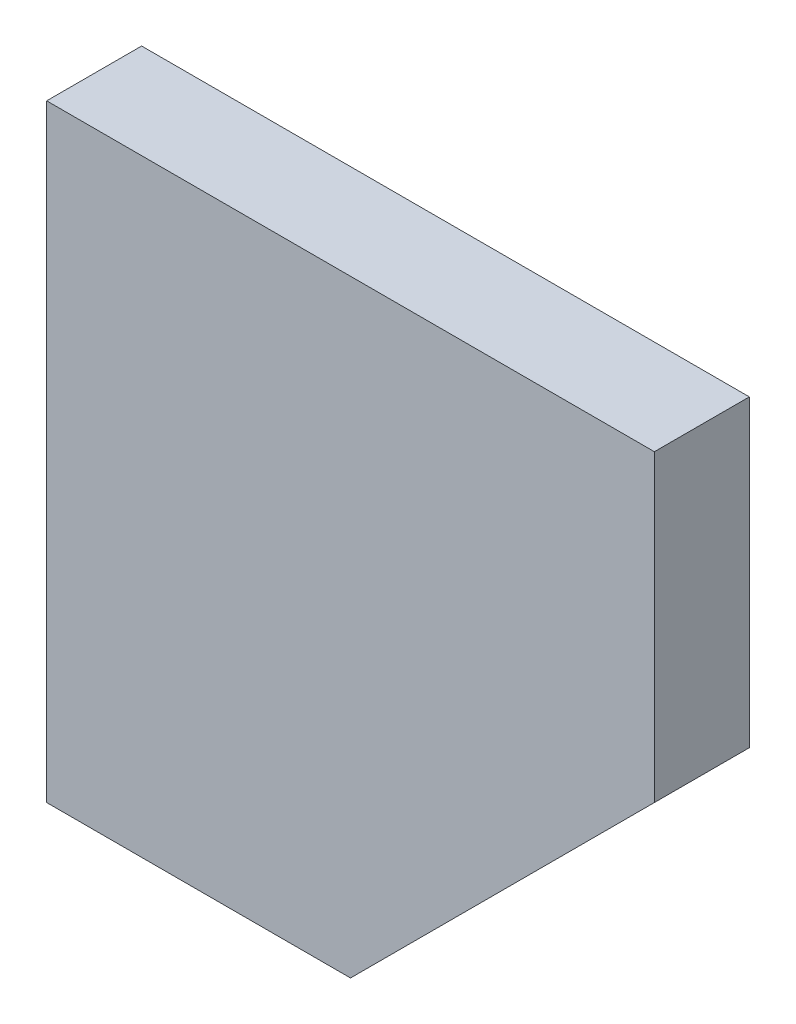
ISO-10303-21;
HEADER;
FILE_DESCRIPTION(('STEP AP214'),'2;1');
FILE_NAME('part.step','',(''),(''),'','','');
FILE_SCHEMA(('AUTOMOTIVE_DESIGN { 1 0 10303 214 1 1 1 1 }'));
ENDSEC;
DATA;
#1=APPLICATION_CONTEXT('core data for automotive mechanical design processes');
#2=APPLICATION_PROTOCOL_DEFINITION('international standard','automotive_design',2000,#1);
#3=PRODUCT_CONTEXT('',#1,'mechanical');
#4=PRODUCT('Part','Part','',(#3));
#5=PRODUCT_RELATED_PRODUCT_CATEGORY('part','',(#4));
#6=PRODUCT_DEFINITION_FORMATION('','',#4);
#7=PRODUCT_DEFINITION_CONTEXT('part definition',#1,'design');
#8=PRODUCT_DEFINITION('design','',#6,#7);
#9=PRODUCT_DEFINITION_SHAPE('','',#8);
#10=(LENGTH_UNIT() NAMED_UNIT(*) SI_UNIT(.MILLI.,.METRE.));
#11=(NAMED_UNIT(*) PLANE_ANGLE_UNIT() SI_UNIT($,.RADIAN.));
#12=(NAMED_UNIT(*) SI_UNIT($,.STERADIAN.) SOLID_ANGLE_UNIT());
#13=UNCERTAINTY_MEASURE_WITH_UNIT(LENGTH_MEASURE(1.E-05),#10,'distance_accuracy_value','');
#14=(GEOMETRIC_REPRESENTATION_CONTEXT(3) GLOBAL_UNCERTAINTY_ASSIGNED_CONTEXT((#13)) GLOBAL_UNIT_ASSIGNED_CONTEXT((#10,
#11,#12)) REPRESENTATION_CONTEXT('',''));
#15=CARTESIAN_POINT('',(0.,0.,0.));
#16=DIRECTION('',(0.,0.,1.));
#17=DIRECTION('',(1.,0.,0.));
#18=AXIS2_PLACEMENT_3D('',#15,#16,#17);
#19=CARTESIAN_POINT('',(25.4,0.,7.9375));
#20=DIRECTION('',(0.,1.,0.));
#21=DIRECTION('',(-1.,0.,0.));
#22=AXIS2_PLACEMENT_3D('',#19,#20,#21);
#23=PLANE('',#22);
#24=DIRECTION('',(1.,0.,0.));
#25=VECTOR('',#24,1.);
#26=CARTESIAN_POINT('',(25.4,0.,0.));
#27=LINE('',#26,#25);
#28=CARTESIAN_POINT('',(0.,0.,0.));
#29=VERTEX_POINT('',#28);
#30=CARTESIAN_POINT('',(25.4,0.,0.));
#31=VERTEX_POINT('',#30);
#32=EDGE_CURVE('E118',#29,#31,#27,.T.);
#33=ORIENTED_EDGE('',*,*,#32,.T.);
#34=DIRECTION('',(0.,0.,-1.));
#35=VECTOR('',#34,1.);
#36=CARTESIAN_POINT('',(25.4,0.,7.9375));
#37=LINE('',#36,#35);
#38=CARTESIAN_POINT('',(25.4,0.,7.9375));
#39=VERTEX_POINT('',#38);
#40=EDGE_CURVE('E11',#39,#31,#37,.T.);
#41=ORIENTED_EDGE('',*,*,#40,.F.);
#42=DIRECTION('',(1.,0.,0.));
#43=VECTOR('',#42,1.);
#44=CARTESIAN_POINT('',(25.4,0.,7.9375));
#45=LINE('',#44,#43);
#46=CARTESIAN_POINT('',(0.,0.,7.9375));
#47=VERTEX_POINT('',#46);
#48=EDGE_CURVE('E131',#47,#39,#45,.T.);
#49=ORIENTED_EDGE('',*,*,#48,.F.);
#50=DIRECTION('',(0.,0.,-1.));
#51=VECTOR('',#50,1.);
#52=CARTESIAN_POINT('',(0.,0.,7.9375));
#53=LINE('',#52,#51);
#54=EDGE_CURVE('E114',#47,#29,#53,.T.);
#55=ORIENTED_EDGE('',*,*,#54,.T.);
#56=EDGE_LOOP('',(#33,#41,#49,#55));
#57=FACE_BOUND('',#56,.T.);
#58=ADVANCED_FACE('F39',(#57),#23,.F.);
#59=CARTESIAN_POINT('',(50.8,25.4,7.9375));
#60=DIRECTION('',(-0.707106781186547,0.707106781186548,0.));
#61=DIRECTION('',(-0.707106781186548,-0.707106781186547,0.));
#62=AXIS2_PLACEMENT_3D('',#59,#60,#61);
#63=PLANE('',#62);
#64=DIRECTION('',(0.707106781186548,0.707106781186547,0.));
#65=VECTOR('',#64,1.);
#66=CARTESIAN_POINT('',(50.8,25.4,0.));
#67=LINE('',#66,#65);
#68=CARTESIAN_POINT('',(50.8,25.4,0.));
#69=VERTEX_POINT('',#68);
#70=EDGE_CURVE('E122',#31,#69,#67,.T.);
#71=ORIENTED_EDGE('',*,*,#70,.T.);
#72=DIRECTION('',(0.,0.,-1.));
#73=VECTOR('',#72,1.);
#74=CARTESIAN_POINT('',(50.8,25.4,7.9375));
#75=LINE('',#74,#73);
#76=CARTESIAN_POINT('',(50.8,25.4,7.9375));
#77=VERTEX_POINT('',#76);
#78=EDGE_CURVE('E48',#77,#69,#75,.T.);
#79=ORIENTED_EDGE('',*,*,#78,.F.);
#80=DIRECTION('',(0.707106781186548,0.707106781186547,0.));
#81=VECTOR('',#80,1.);
#82=CARTESIAN_POINT('',(50.8,25.4,7.9375));
#83=LINE('',#82,#81);
#84=EDGE_CURVE('E90',#39,#77,#83,.T.);
#85=ORIENTED_EDGE('',*,*,#84,.F.);
#86=ORIENTED_EDGE('',*,*,#40,.T.);
#87=EDGE_LOOP('',(#71,#79,#85,#86));
#88=FACE_BOUND('',#87,.T.);
#89=ADVANCED_FACE('F153',(#88),#63,.F.);
#90=CARTESIAN_POINT('',(50.8,50.8,7.9375));
#91=DIRECTION('',(-1.,0.,0.));
#92=DIRECTION('',(0.,-1.,0.));
#93=AXIS2_PLACEMENT_3D('',#90,#91,#92);
#94=PLANE('',#93);
#95=DIRECTION('',(0.,1.,0.));
#96=VECTOR('',#95,1.);
#97=CARTESIAN_POINT('',(50.8,50.8,0.));
#98=LINE('',#97,#96);
#99=CARTESIAN_POINT('',(50.8,50.8,0.));
#100=VERTEX_POINT('',#99);
#101=EDGE_CURVE('E106',#69,#100,#98,.T.);
#102=ORIENTED_EDGE('',*,*,#101,.T.);
#103=DIRECTION('',(0.,0.,-1.));
#104=VECTOR('',#103,1.);
#105=CARTESIAN_POINT('',(50.8,50.8,7.9375));
#106=LINE('',#105,#104);
#107=CARTESIAN_POINT('',(50.8,50.8,7.9375));
#108=VERTEX_POINT('',#107);
#109=EDGE_CURVE('E103',#108,#100,#106,.T.);
#110=ORIENTED_EDGE('',*,*,#109,.F.);
#111=DIRECTION('',(0.,1.,0.));
#112=VECTOR('',#111,1.);
#113=CARTESIAN_POINT('',(50.8,50.8,7.9375));
#114=LINE('',#113,#112);
#115=EDGE_CURVE('E94',#77,#108,#114,.T.);
#116=ORIENTED_EDGE('',*,*,#115,.F.);
#117=ORIENTED_EDGE('',*,*,#78,.T.);
#118=EDGE_LOOP('',(#102,#110,#116,#117));
#119=FACE_BOUND('',#118,.T.);
#120=ADVANCED_FACE('F104',(#119),#94,.F.);
#121=CARTESIAN_POINT('',(0.,50.8,7.9375));
#122=DIRECTION('',(0.,-1.,0.));
#123=DIRECTION('',(0.,0.,-1.));
#124=AXIS2_PLACEMENT_3D('',#121,#122,#123);
#125=PLANE('',#124);
#126=DIRECTION('',(-1.,0.,0.));
#127=VECTOR('',#126,1.);
#128=CARTESIAN_POINT('',(0.,50.8,0.));
#129=LINE('',#128,#127);
#130=CARTESIAN_POINT('',(0.,50.8,0.));
#131=VERTEX_POINT('',#130);
#132=EDGE_CURVE('E76',#100,#131,#129,.T.);
#133=ORIENTED_EDGE('',*,*,#132,.T.);
#134=DIRECTION('',(0.,0.,-1.));
#135=VECTOR('',#134,1.);
#136=CARTESIAN_POINT('',(0.,50.8,7.9375));
#137=LINE('',#136,#135);
#138=CARTESIAN_POINT('',(0.,50.8,7.9375));
#139=VERTEX_POINT('',#138);
#140=EDGE_CURVE('E108',#139,#131,#137,.T.);
#141=ORIENTED_EDGE('',*,*,#140,.F.);
#142=DIRECTION('',(-1.,0.,0.));
#143=VECTOR('',#142,1.);
#144=CARTESIAN_POINT('',(0.,50.8,7.9375));
#145=LINE('',#144,#143);
#146=EDGE_CURVE('E98',#108,#139,#145,.T.);
#147=ORIENTED_EDGE('',*,*,#146,.F.);
#148=ORIENTED_EDGE('',*,*,#109,.T.);
#149=EDGE_LOOP('',(#133,#141,#147,#148));
#150=FACE_BOUND('',#149,.T.);
#151=ADVANCED_FACE('F110',(#150),#125,.F.);
#152=CARTESIAN_POINT('',(0.,0.,7.9375));
#153=DIRECTION('',(1.,0.,0.));
#154=DIRECTION('',(0.,0.,-1.));
#155=AXIS2_PLACEMENT_3D('',#152,#153,#154);
#156=PLANE('',#155);
#157=DIRECTION('',(0.,-1.,0.));
#158=VECTOR('',#157,1.);
#159=CARTESIAN_POINT('',(0.,0.,0.));
#160=LINE('',#159,#158);
#161=EDGE_CURVE('E82',#131,#29,#160,.T.);
#162=ORIENTED_EDGE('',*,*,#161,.T.);
#163=ORIENTED_EDGE('',*,*,#54,.F.);
#164=DIRECTION('',(0.,-1.,0.));
#165=VECTOR('',#164,1.);
#166=CARTESIAN_POINT('',(0.,0.,7.9375));
#167=LINE('',#166,#165);
#168=EDGE_CURVE('E56',#139,#47,#167,.T.);
#169=ORIENTED_EDGE('',*,*,#168,.F.);
#170=ORIENTED_EDGE('',*,*,#140,.T.);
#171=EDGE_LOOP('',(#162,#163,#169,#170));
#172=FACE_BOUND('',#171,.T.);
#173=ADVANCED_FACE('F142',(#172),#156,.F.);
#174=CARTESIAN_POINT('',(0.,0.,7.9375));
#175=DIRECTION('',(0.,0.,-1.));
#176=DIRECTION('',(-1.,0.,0.));
#177=AXIS2_PLACEMENT_3D('',#174,#175,#176);
#178=PLANE('',#177);
#179=ORIENTED_EDGE('',*,*,#48,.T.);
#180=ORIENTED_EDGE('',*,*,#84,.T.);
#181=ORIENTED_EDGE('',*,*,#115,.T.);
#182=ORIENTED_EDGE('',*,*,#146,.T.);
#183=ORIENTED_EDGE('',*,*,#168,.T.);
#184=EDGE_LOOP('',(#179,#180,#181,#182,#183));
#185=FACE_BOUND('',#184,.T.);
#186=ADVANCED_FACE('F96',(#185),#178,.F.);
#187=CARTESIAN_POINT('',(0.,0.,0.));
#188=DIRECTION('',(0.,0.,-1.));
#189=DIRECTION('',(-1.,0.,0.));
#190=AXIS2_PLACEMENT_3D('',#187,#188,#189);
#191=PLANE('',#190);
#192=ORIENTED_EDGE('',*,*,#32,.F.);
#193=ORIENTED_EDGE('',*,*,#161,.F.);
#194=ORIENTED_EDGE('',*,*,#132,.F.);
#195=ORIENTED_EDGE('',*,*,#101,.F.);
#196=ORIENTED_EDGE('',*,*,#70,.F.);
#197=EDGE_LOOP('',(#192,#193,#194,#195,#196));
#198=FACE_BOUND('',#197,.T.);
#199=ADVANCED_FACE('F138',(#198),#191,.T.);
#200=CLOSED_SHELL('',(#58,#89,#120,#151,#173,#186,#199));
#201=MANIFOLD_SOLID_BREP('B2',#200);
#202=ADVANCED_BREP_SHAPE_REPRESENTATION('',(#18,#201),#14);
#203=SHAPE_DEFINITION_REPRESENTATION(#9,#202);
ENDSEC;
END-ISO-10303-21;
